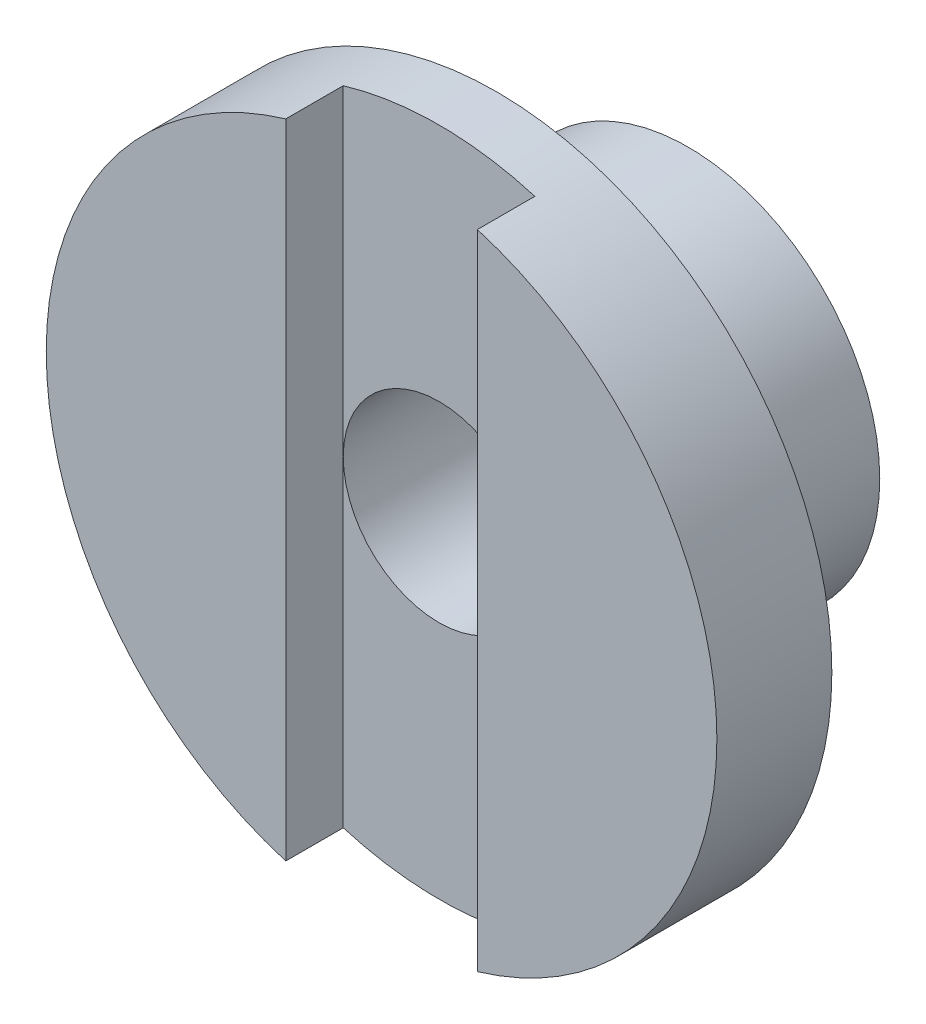
ISO-10303-21;
HEADER;
FILE_DESCRIPTION(('STEP AP214'),'2;1');
FILE_NAME('part.step','',(''),(''),'','','');
FILE_SCHEMA(('AUTOMOTIVE_DESIGN { 1 0 10303 214 1 1 1 1 }'));
ENDSEC;
DATA;
#1=APPLICATION_CONTEXT('core data for automotive mechanical design processes');
#2=APPLICATION_PROTOCOL_DEFINITION('international standard','automotive_design',2000,#1);
#3=PRODUCT_CONTEXT('',#1,'mechanical');
#4=PRODUCT('Part','Part','',(#3));
#5=PRODUCT_RELATED_PRODUCT_CATEGORY('part','',(#4));
#6=PRODUCT_DEFINITION_FORMATION('','',#4);
#7=PRODUCT_DEFINITION_CONTEXT('part definition',#1,'design');
#8=PRODUCT_DEFINITION('design','',#6,#7);
#9=PRODUCT_DEFINITION_SHAPE('','',#8);
#10=(LENGTH_UNIT() NAMED_UNIT(*) SI_UNIT(.MILLI.,.METRE.));
#11=(NAMED_UNIT(*) PLANE_ANGLE_UNIT() SI_UNIT($,.RADIAN.));
#12=(NAMED_UNIT(*) SI_UNIT($,.STERADIAN.) SOLID_ANGLE_UNIT());
#13=UNCERTAINTY_MEASURE_WITH_UNIT(LENGTH_MEASURE(1.E-05),#10,'distance_accuracy_value','');
#14=(GEOMETRIC_REPRESENTATION_CONTEXT(3) GLOBAL_UNCERTAINTY_ASSIGNED_CONTEXT((#13)) GLOBAL_UNIT_ASSIGNED_CONTEXT((#10,
#11,#12)) REPRESENTATION_CONTEXT('',''));
#15=CARTESIAN_POINT('',(0.,0.,0.));
#16=DIRECTION('',(0.,0.,1.));
#17=DIRECTION('',(1.,0.,0.));
#18=AXIS2_PLACEMENT_3D('',#15,#16,#17);
#19=CARTESIAN_POINT('',(0.,0.,0.));
#20=DIRECTION('',(0.,0.,1.));
#21=DIRECTION('',(1.,0.,0.));
#22=AXIS2_PLACEMENT_3D('',#19,#20,#21);
#23=PLANE('',#22);
#24=CARTESIAN_POINT('',(0.,0.,0.));
#25=DIRECTION('',(0.,0.,1.));
#26=DIRECTION('',(1.,0.,0.));
#27=AXIS2_PLACEMENT_3D('',#24,#25,#26);
#28=CIRCLE('',#27,17.5);
#29=CARTESIAN_POINT('',(17.5,0.,0.));
#30=VERTEX_POINT('',#29);
#31=EDGE_CURVE('E115',#30,#30,#28,.T.);
#32=ORIENTED_EDGE('',*,*,#31,.F.);
#33=EDGE_LOOP('',(#32));
#34=FACE_BOUND('',#33,.T.);
#35=CARTESIAN_POINT('',(0.,0.,0.));
#36=DIRECTION('',(0.,0.,1.));
#37=DIRECTION('',(1.,0.,0.));
#38=AXIS2_PLACEMENT_3D('',#35,#36,#37);
#39=CIRCLE('',#38,10.);
#40=CARTESIAN_POINT('',(10.,0.,0.));
#41=VERTEX_POINT('',#40);
#42=EDGE_CURVE('E11',#41,#41,#39,.F.);
#43=ORIENTED_EDGE('',*,*,#42,.F.);
#44=EDGE_LOOP('',(#43));
#45=FACE_BOUND('',#44,.T.);
#46=ADVANCED_FACE('F33',(#34,#45),#23,.F.);
#47=CARTESIAN_POINT('',(0.,0.,3.));
#48=DIRECTION('',(0.,0.,1.));
#49=DIRECTION('',(1.,0.,0.));
#50=AXIS2_PLACEMENT_3D('',#47,#48,#49);
#51=PLANE('',#50);
#52=CARTESIAN_POINT('',(0.,0.,3.));
#53=DIRECTION('',(0.,0.,1.));
#54=DIRECTION('',(1.,0.,0.));
#55=AXIS2_PLACEMENT_3D('',#52,#53,#54);
#56=CIRCLE('',#55,5.);
#57=CARTESIAN_POINT('',(5.,0.,3.));
#58=VERTEX_POINT('',#57);
#59=CARTESIAN_POINT('',(-5.,0.,3.));
#60=VERTEX_POINT('',#59);
#61=EDGE_CURVE('E41',#58,#60,#56,.T.);
#62=ORIENTED_EDGE('',*,*,#61,.F.);
#63=DIRECTION('',(0.,1.,0.));
#64=VECTOR('',#63,1.);
#65=CARTESIAN_POINT('',(5.,16.7705098312484,3.));
#66=LINE('',#65,#64);
#67=CARTESIAN_POINT('',(5.,16.7705098312484,3.));
#68=VERTEX_POINT('',#67);
#69=EDGE_CURVE('E88',#58,#68,#66,.T.);
#70=ORIENTED_EDGE('',*,*,#69,.T.);
#71=CARTESIAN_POINT('',(0.,0.,3.));
#72=DIRECTION('',(0.,0.,1.));
#73=DIRECTION('',(1.,0.,0.));
#74=AXIS2_PLACEMENT_3D('',#71,#72,#73);
#75=CIRCLE('',#74,17.5);
#76=CARTESIAN_POINT('',(-5.,16.7705098312484,3.));
#77=VERTEX_POINT('',#76);
#78=EDGE_CURVE('E113',#68,#77,#75,.T.);
#79=ORIENTED_EDGE('',*,*,#78,.T.);
#80=DIRECTION('',(0.,-1.,0.));
#81=VECTOR('',#80,1.);
#82=CARTESIAN_POINT('',(-5.,16.7705098312484,3.));
#83=LINE('',#82,#81);
#84=EDGE_CURVE('E90',#77,#60,#83,.T.);
#85=ORIENTED_EDGE('',*,*,#84,.T.);
#86=EDGE_LOOP('',(#62,#70,#79,#85));
#87=FACE_BOUND('',#86,.T.);
#88=ADVANCED_FACE('F86',(#87),#51,.T.);
#89=CARTESIAN_POINT('',(0.,0.,6.));
#90=DIRECTION('',(0.,0.,1.));
#91=DIRECTION('',(1.,0.,0.));
#92=AXIS2_PLACEMENT_3D('',#89,#90,#91);
#93=PLANE('',#92);
#94=DIRECTION('',(0.,1.,0.));
#95=VECTOR('',#94,1.);
#96=CARTESIAN_POINT('',(5.,16.7705098312484,6.));
#97=LINE('',#96,#95);
#98=CARTESIAN_POINT('',(5.,-16.7705098312484,6.));
#99=VERTEX_POINT('',#98);
#100=CARTESIAN_POINT('',(5.,16.7705098312484,6.));
#101=VERTEX_POINT('',#100);
#102=EDGE_CURVE('E110',#99,#101,#97,.T.);
#103=ORIENTED_EDGE('',*,*,#102,.F.);
#104=CARTESIAN_POINT('',(0.,0.,6.));
#105=DIRECTION('',(0.,0.,1.));
#106=DIRECTION('',(1.,0.,0.));
#107=AXIS2_PLACEMENT_3D('',#104,#105,#106);
#108=CIRCLE('',#107,17.5);
#109=EDGE_CURVE('E120',#99,#101,#108,.T.);
#110=ORIENTED_EDGE('',*,*,#109,.T.);
#111=EDGE_LOOP('',(#103,#110));
#112=FACE_BOUND('',#111,.T.);
#113=ADVANCED_FACE('F155',(#112),#93,.T.);
#114=CARTESIAN_POINT('',(0.,0.,6.));
#115=DIRECTION('',(0.,0.,-1.));
#116=DIRECTION('',(-1.,0.,0.));
#117=AXIS2_PLACEMENT_3D('',#114,#115,#116);
#118=CYLINDRICAL_SURFACE('',#117,17.5);
#119=ORIENTED_EDGE('',*,*,#78,.F.);
#120=DIRECTION('',(0.,0.,1.));
#121=VECTOR('',#120,1.);
#122=CARTESIAN_POINT('',(5.,16.7705098312484,3.));
#123=LINE('',#122,#121);
#124=EDGE_CURVE('E97',#68,#101,#123,.T.);
#125=ORIENTED_EDGE('',*,*,#124,.T.);
#126=ORIENTED_EDGE('',*,*,#109,.F.);
#127=DIRECTION('',(0.,0.,1.));
#128=VECTOR('',#127,1.);
#129=CARTESIAN_POINT('',(5.,-16.7705098312484,3.));
#130=LINE('',#129,#128);
#131=CARTESIAN_POINT('',(5.,-16.7705098312484,3.));
#132=VERTEX_POINT('',#131);
#133=EDGE_CURVE('E116',#132,#99,#130,.T.);
#134=ORIENTED_EDGE('',*,*,#133,.F.);
#135=CARTESIAN_POINT('',(0.,0.,3.));
#136=DIRECTION('',(0.,0.,1.));
#137=DIRECTION('',(1.,0.,0.));
#138=AXIS2_PLACEMENT_3D('',#135,#136,#137);
#139=CIRCLE('',#138,17.5);
#140=CARTESIAN_POINT('',(-5.00000000000001,-16.7705098312484,3.));
#141=VERTEX_POINT('',#140);
#142=EDGE_CURVE('E99',#141,#132,#139,.T.);
#143=ORIENTED_EDGE('',*,*,#142,.F.);
#144=DIRECTION('',(0.,0.,1.));
#145=VECTOR('',#144,1.);
#146=CARTESIAN_POINT('',(-5.00000000000001,-16.7705098312484,3.));
#147=LINE('',#146,#145);
#148=CARTESIAN_POINT('',(-5.00000000000001,-16.7705098312484,6.));
#149=VERTEX_POINT('',#148);
#150=EDGE_CURVE('E103',#141,#149,#147,.T.);
#151=ORIENTED_EDGE('',*,*,#150,.T.);
#152=CARTESIAN_POINT('',(-5.,16.7705098312484,6.));
#153=VERTEX_POINT('',#152);
#154=EDGE_CURVE('E82',#153,#149,#108,.T.);
#155=ORIENTED_EDGE('',*,*,#154,.F.);
#156=DIRECTION('',(0.,0.,1.));
#157=VECTOR('',#156,1.);
#158=CARTESIAN_POINT('',(-5.,16.7705098312484,3.));
#159=LINE('',#158,#157);
#160=EDGE_CURVE('E54',#77,#153,#159,.T.);
#161=ORIENTED_EDGE('',*,*,#160,.F.);
#162=EDGE_LOOP('',(#119,#125,#126,#134,#143,#151,#155,#161));
#163=FACE_BOUND('',#162,.T.);
#164=ORIENTED_EDGE('',*,*,#31,.T.);
#165=EDGE_LOOP('',(#164));
#166=FACE_BOUND('',#165,.T.);
#167=ADVANCED_FACE('F35',(#163,#166),#118,.T.);
#168=DIRECTION('',(0.,-1.,0.));
#169=VECTOR('',#168,1.);
#170=CARTESIAN_POINT('',(-5.,16.7705098312484,6.));
#171=LINE('',#170,#169);
#172=EDGE_CURVE('E108',#153,#149,#171,.T.);
#173=ORIENTED_EDGE('',*,*,#172,.F.);
#174=ORIENTED_EDGE('',*,*,#154,.T.);
#175=EDGE_LOOP('',(#173,#174));
#176=FACE_BOUND('',#175,.T.);
#177=ADVANCED_FACE('F150',(#176),#93,.T.);
#178=CARTESIAN_POINT('',(5.,16.7705098312484,3.));
#179=DIRECTION('',(1.,0.,0.));
#180=DIRECTION('',(0.,0.,-1.));
#181=AXIS2_PLACEMENT_3D('',#178,#179,#180);
#182=PLANE('',#181);
#183=ORIENTED_EDGE('',*,*,#69,.F.);
#184=EDGE_CURVE('E94',#132,#58,#66,.T.);
#185=ORIENTED_EDGE('',*,*,#184,.F.);
#186=ORIENTED_EDGE('',*,*,#133,.T.);
#187=ORIENTED_EDGE('',*,*,#102,.T.);
#188=ORIENTED_EDGE('',*,*,#124,.F.);
#189=EDGE_LOOP('',(#183,#185,#186,#187,#188));
#190=FACE_BOUND('',#189,.T.);
#191=ADVANCED_FACE('F93',(#190),#182,.F.);
#192=CARTESIAN_POINT('',(-5.,16.7705098312484,3.));
#193=DIRECTION('',(-1.,0.,0.));
#194=DIRECTION('',(0.,0.,1.));
#195=AXIS2_PLACEMENT_3D('',#192,#193,#194);
#196=PLANE('',#195);
#197=EDGE_CURVE('E168',#60,#141,#83,.T.);
#198=ORIENTED_EDGE('',*,*,#197,.F.);
#199=ORIENTED_EDGE('',*,*,#84,.F.);
#200=ORIENTED_EDGE('',*,*,#160,.T.);
#201=ORIENTED_EDGE('',*,*,#172,.T.);
#202=ORIENTED_EDGE('',*,*,#150,.F.);
#203=EDGE_LOOP('',(#198,#199,#200,#201,#202));
#204=FACE_BOUND('',#203,.T.);
#205=ADVANCED_FACE('F147',(#204),#196,.F.);
#206=EDGE_CURVE('E76',#60,#58,#56,.T.);
#207=ORIENTED_EDGE('',*,*,#206,.F.);
#208=ORIENTED_EDGE('',*,*,#197,.T.);
#209=ORIENTED_EDGE('',*,*,#142,.T.);
#210=ORIENTED_EDGE('',*,*,#184,.T.);
#211=EDGE_LOOP('',(#207,#208,#209,#210));
#212=FACE_BOUND('',#211,.T.);
#213=ADVANCED_FACE('F101',(#212),#51,.T.);
#214=CARTESIAN_POINT('',(0.,0.,-5.));
#215=DIRECTION('',(0.,0.,1.));
#216=DIRECTION('',(1.,0.,0.));
#217=AXIS2_PLACEMENT_3D('',#214,#215,#216);
#218=CYLINDRICAL_SURFACE('',#217,5.);
#219=ORIENTED_EDGE('',*,*,#61,.T.);
#220=ORIENTED_EDGE('',*,*,#206,.T.);
#221=EDGE_LOOP('',(#219,#220));
#222=FACE_BOUND('',#221,.T.);
#223=CARTESIAN_POINT('',(0.,0.,-10.));
#224=DIRECTION('',(0.,0.,-1.));
#225=DIRECTION('',(-1.,0.,0.));
#226=AXIS2_PLACEMENT_3D('',#223,#224,#225);
#227=CIRCLE('',#226,5.);
#228=CARTESIAN_POINT('',(-5.,0.,-10.));
#229=VERTEX_POINT('',#228);
#230=EDGE_CURVE('E173',#229,#229,#227,.T.);
#231=ORIENTED_EDGE('',*,*,#230,.T.);
#232=EDGE_LOOP('',(#231));
#233=FACE_BOUND('',#232,.T.);
#234=ADVANCED_FACE('F77',(#222,#233),#218,.F.);
#235=CARTESIAN_POINT('',(0.,0.,-10.));
#236=DIRECTION('',(0.,0.,-1.));
#237=DIRECTION('',(-1.,0.,0.));
#238=AXIS2_PLACEMENT_3D('',#235,#236,#237);
#239=PLANE('',#238);
#240=CARTESIAN_POINT('',(0.,0.,-10.));
#241=DIRECTION('',(0.,0.,-1.));
#242=DIRECTION('',(-1.,0.,0.));
#243=AXIS2_PLACEMENT_3D('',#240,#241,#242);
#244=CIRCLE('',#243,10.);
#245=CARTESIAN_POINT('',(-10.,0.,-10.));
#246=VERTEX_POINT('',#245);
#247=EDGE_CURVE('E111',#246,#246,#244,.T.);
#248=ORIENTED_EDGE('',*,*,#247,.T.);
#249=EDGE_LOOP('',(#248));
#250=FACE_BOUND('',#249,.T.);
#251=ORIENTED_EDGE('',*,*,#230,.F.);
#252=EDGE_LOOP('',(#251));
#253=FACE_BOUND('',#252,.T.);
#254=ADVANCED_FACE('F133',(#250,#253),#239,.T.);
#255=CARTESIAN_POINT('',(0.,0.,-10.));
#256=DIRECTION('',(0.,0.,1.));
#257=DIRECTION('',(1.,0.,0.));
#258=AXIS2_PLACEMENT_3D('',#255,#256,#257);
#259=CYLINDRICAL_SURFACE('',#258,10.);
#260=ORIENTED_EDGE('',*,*,#247,.F.);
#261=EDGE_LOOP('',(#260));
#262=FACE_BOUND('',#261,.T.);
#263=ORIENTED_EDGE('',*,*,#42,.T.);
#264=EDGE_LOOP('',(#263));
#265=FACE_BOUND('',#264,.T.);
#266=ADVANCED_FACE('F131',(#262,#265),#259,.T.);
#267=CLOSED_SHELL('',(#46,#88,#113,#167,#177,#191,#205,#213,#234,#254,#266));
#268=MANIFOLD_SOLID_BREP('B2',#267);
#269=ADVANCED_BREP_SHAPE_REPRESENTATION('',(#18,#268),#14);
#270=SHAPE_DEFINITION_REPRESENTATION(#9,#269);
ENDSEC;
END-ISO-10303-21;
